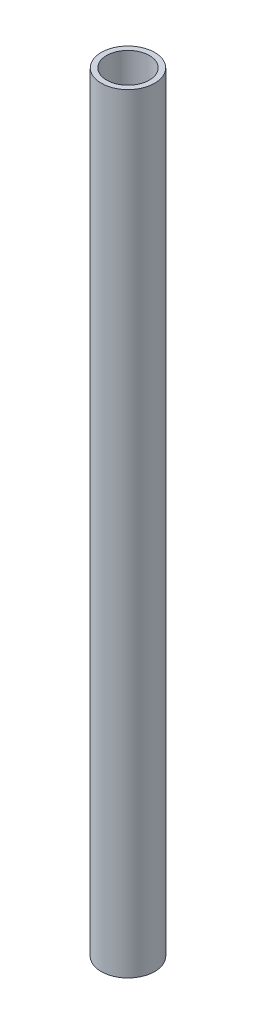
ISO-10303-21;
HEADER;
FILE_DESCRIPTION(('STEP AP214'),'2;1');
FILE_NAME('part.step','',(''),(''),'','','');
FILE_SCHEMA(('AUTOMOTIVE_DESIGN { 1 0 10303 214 1 1 1 1 }'));
ENDSEC;
DATA;
#1=APPLICATION_CONTEXT('core data for automotive mechanical design processes');
#2=APPLICATION_PROTOCOL_DEFINITION('international standard','automotive_design',2000,#1);
#3=PRODUCT_CONTEXT('',#1,'mechanical');
#4=PRODUCT('Part','Part','',(#3));
#5=PRODUCT_RELATED_PRODUCT_CATEGORY('part','',(#4));
#6=PRODUCT_DEFINITION_FORMATION('','',#4);
#7=PRODUCT_DEFINITION_CONTEXT('part definition',#1,'design');
#8=PRODUCT_DEFINITION('design','',#6,#7);
#9=PRODUCT_DEFINITION_SHAPE('','',#8);
#10=(LENGTH_UNIT() NAMED_UNIT(*) SI_UNIT(.MILLI.,.METRE.));
#11=(NAMED_UNIT(*) PLANE_ANGLE_UNIT() SI_UNIT($,.RADIAN.));
#12=(NAMED_UNIT(*) SI_UNIT($,.STERADIAN.) SOLID_ANGLE_UNIT());
#13=UNCERTAINTY_MEASURE_WITH_UNIT(LENGTH_MEASURE(1.E-05),#10,'distance_accuracy_value','');
#14=(GEOMETRIC_REPRESENTATION_CONTEXT(3) GLOBAL_UNCERTAINTY_ASSIGNED_CONTEXT((#13)) GLOBAL_UNIT_ASSIGNED_CONTEXT((#10,
#11,#12)) REPRESENTATION_CONTEXT('',''));
#15=CARTESIAN_POINT('',(0.,0.,0.));
#16=DIRECTION('',(0.,0.,1.));
#17=DIRECTION('',(1.,0.,0.));
#18=AXIS2_PLACEMENT_3D('',#15,#16,#17);
#19=CARTESIAN_POINT('',(0.,432.,0.));
#20=DIRECTION('',(0.,1.,0.));
#21=DIRECTION('',(0.,0.,1.));
#22=AXIS2_PLACEMENT_3D('',#19,#20,#21);
#23=PLANE('',#22);
#24=CARTESIAN_POINT('',(0.,432.,0.));
#25=DIRECTION('',(0.,1.,0.));
#26=DIRECTION('',(0.,0.,1.));
#27=AXIS2_PLACEMENT_3D('',#24,#25,#26);
#28=CIRCLE('',#27,15.);
#29=CARTESIAN_POINT('',(0.,432.,15.));
#30=VERTEX_POINT('',#29);
#31=EDGE_CURVE('E10',#30,#30,#28,.T.);
#32=ORIENTED_EDGE('',*,*,#31,.T.);
#33=EDGE_LOOP('',(#32));
#34=FACE_BOUND('',#33,.T.);
#35=CARTESIAN_POINT('',(0.,432.,0.));
#36=DIRECTION('',(0.,1.,0.));
#37=DIRECTION('',(0.,0.,1.));
#38=AXIS2_PLACEMENT_3D('',#35,#36,#37);
#39=CIRCLE('',#38,12.);
#40=CARTESIAN_POINT('',(0.,432.,12.));
#41=VERTEX_POINT('',#40);
#42=EDGE_CURVE('E42',#41,#41,#39,.T.);
#43=ORIENTED_EDGE('',*,*,#42,.F.);
#44=EDGE_LOOP('',(#43));
#45=FACE_BOUND('',#44,.T.);
#46=ADVANCED_FACE('F31',(#34,#45),#23,.T.);
#47=CARTESIAN_POINT('',(0.,0.,0.));
#48=DIRECTION('',(0.,1.,0.));
#49=DIRECTION('',(0.,0.,1.));
#50=AXIS2_PLACEMENT_3D('',#47,#48,#49);
#51=PLANE('',#50);
#52=CARTESIAN_POINT('',(0.,0.,0.));
#53=DIRECTION('',(0.,1.,0.));
#54=DIRECTION('',(0.,0.,1.));
#55=AXIS2_PLACEMENT_3D('',#52,#53,#54);
#56=CIRCLE('',#55,15.);
#57=CARTESIAN_POINT('',(0.,0.,15.));
#58=VERTEX_POINT('',#57);
#59=EDGE_CURVE('E35',#58,#58,#56,.T.);
#60=ORIENTED_EDGE('',*,*,#59,.F.);
#61=EDGE_LOOP('',(#60));
#62=FACE_BOUND('',#61,.T.);
#63=CARTESIAN_POINT('',(0.,0.,0.));
#64=DIRECTION('',(0.,1.,0.));
#65=DIRECTION('',(0.,0.,1.));
#66=AXIS2_PLACEMENT_3D('',#63,#64,#65);
#67=CIRCLE('',#66,12.);
#68=CARTESIAN_POINT('',(0.,0.,12.));
#69=VERTEX_POINT('',#68);
#70=EDGE_CURVE('E44',#69,#69,#67,.T.);
#71=ORIENTED_EDGE('',*,*,#70,.T.);
#72=EDGE_LOOP('',(#71));
#73=FACE_BOUND('',#72,.T.);
#74=ADVANCED_FACE('F54',(#62,#73),#51,.F.);
#75=CARTESIAN_POINT('',(0.,432.,0.));
#76=DIRECTION('',(0.,-1.,0.));
#77=DIRECTION('',(0.,0.,-1.));
#78=AXIS2_PLACEMENT_3D('',#75,#76,#77);
#79=CYLINDRICAL_SURFACE('',#78,15.);
#80=ORIENTED_EDGE('',*,*,#31,.F.);
#81=EDGE_LOOP('',(#80));
#82=FACE_BOUND('',#81,.T.);
#83=ORIENTED_EDGE('',*,*,#59,.T.);
#84=EDGE_LOOP('',(#83));
#85=FACE_BOUND('',#84,.T.);
#86=ADVANCED_FACE('F33',(#82,#85),#79,.T.);
#87=CARTESIAN_POINT('',(0.,432.,0.));
#88=DIRECTION('',(0.,-1.,0.));
#89=DIRECTION('',(0.,0.,-1.));
#90=AXIS2_PLACEMENT_3D('',#87,#88,#89);
#91=CYLINDRICAL_SURFACE('',#90,12.);
#92=ORIENTED_EDGE('',*,*,#42,.T.);
#93=EDGE_LOOP('',(#92));
#94=FACE_BOUND('',#93,.T.);
#95=ORIENTED_EDGE('',*,*,#70,.F.);
#96=EDGE_LOOP('',(#95));
#97=FACE_BOUND('',#96,.T.);
#98=ADVANCED_FACE('F50',(#94,#97),#91,.F.);
#99=CLOSED_SHELL('',(#46,#74,#86,#98));
#100=MANIFOLD_SOLID_BREP('B2',#99);
#101=ADVANCED_BREP_SHAPE_REPRESENTATION('',(#18,#100),#14);
#102=SHAPE_DEFINITION_REPRESENTATION(#9,#101);
ENDSEC;
END-ISO-10303-21;
